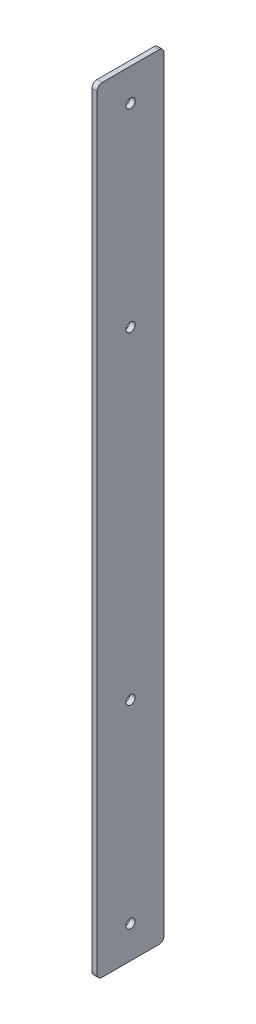
ISO-10303-21;
HEADER;
FILE_DESCRIPTION(('STEP AP214'),'2;1');
FILE_NAME('part.step','',(''),(''),'','','');
FILE_SCHEMA(('AUTOMOTIVE_DESIGN { 1 0 10303 214 1 1 1 1 }'));
ENDSEC;
DATA;
#1=APPLICATION_CONTEXT('core data for automotive mechanical design processes');
#2=APPLICATION_PROTOCOL_DEFINITION('international standard','automotive_design',2000,#1);
#3=PRODUCT_CONTEXT('',#1,'mechanical');
#4=PRODUCT('Part','Part','',(#3));
#5=PRODUCT_RELATED_PRODUCT_CATEGORY('part','',(#4));
#6=PRODUCT_DEFINITION_FORMATION('','',#4);
#7=PRODUCT_DEFINITION_CONTEXT('part definition',#1,'design');
#8=PRODUCT_DEFINITION('design','',#6,#7);
#9=PRODUCT_DEFINITION_SHAPE('','',#8);
#10=(LENGTH_UNIT() NAMED_UNIT(*) SI_UNIT(.MILLI.,.METRE.));
#11=(NAMED_UNIT(*) PLANE_ANGLE_UNIT() SI_UNIT($,.RADIAN.));
#12=(NAMED_UNIT(*) SI_UNIT($,.STERADIAN.) SOLID_ANGLE_UNIT());
#13=UNCERTAINTY_MEASURE_WITH_UNIT(LENGTH_MEASURE(1.E-05),#10,'distance_accuracy_value','');
#14=(GEOMETRIC_REPRESENTATION_CONTEXT(3) GLOBAL_UNCERTAINTY_ASSIGNED_CONTEXT((#13)) GLOBAL_UNIT_ASSIGNED_CONTEXT((#10,
#11,#12)) REPRESENTATION_CONTEXT('',''));
#15=CARTESIAN_POINT('',(0.,0.,0.));
#16=DIRECTION('',(0.,0.,1.));
#17=DIRECTION('',(1.,0.,0.));
#18=AXIS2_PLACEMENT_3D('',#15,#16,#17);
#19=CARTESIAN_POINT('',(2.,0.,0.));
#20=DIRECTION('',(-1.,0.,0.));
#21=DIRECTION('',(0.,0.,1.));
#22=AXIS2_PLACEMENT_3D('',#19,#20,#21);
#23=PLANE('',#22);
#24=CARTESIAN_POINT('',(2.,62.5,0.));
#25=DIRECTION('',(1.,0.,0.));
#26=DIRECTION('',(0.,0.,-1.));
#27=AXIS2_PLACEMENT_3D('',#24,#25,#26);
#28=CIRCLE('',#27,1.75);
#29=CARTESIAN_POINT('',(2.,62.5,-1.75000000000001));
#30=VERTEX_POINT('',#29);
#31=EDGE_CURVE('E231',#30,#30,#28,.T.);
#32=ORIENTED_EDGE('',*,*,#31,.F.);
#33=EDGE_LOOP('',(#32));
#34=FACE_BOUND('',#33,.T.);
#35=CARTESIAN_POINT('',(2.,137.5,0.));
#36=DIRECTION('',(1.,0.,0.));
#37=DIRECTION('',(0.,0.,-1.));
#38=AXIS2_PLACEMENT_3D('',#35,#36,#37);
#39=CIRCLE('',#38,1.75);
#40=CARTESIAN_POINT('',(2.,137.5,-1.75));
#41=VERTEX_POINT('',#40);
#42=EDGE_CURVE('E223',#41,#41,#39,.T.);
#43=ORIENTED_EDGE('',*,*,#42,.F.);
#44=EDGE_LOOP('',(#43));
#45=FACE_BOUND('',#44,.T.);
#46=DIRECTION('',(0.,0.,-1.));
#47=VECTOR('',#46,1.);
#48=CARTESIAN_POINT('',(2.,-150.,13.));
#49=LINE('',#48,#47);
#50=CARTESIAN_POINT('',(2.,-150.,11.));
#51=VERTEX_POINT('',#50);
#52=CARTESIAN_POINT('',(2.,-150.,-11.));
#53=VERTEX_POINT('',#52);
#54=EDGE_CURVE('E150',#51,#53,#49,.T.);
#55=ORIENTED_EDGE('',*,*,#54,.T.);
#56=CARTESIAN_POINT('',(2.,-148.,-11.));
#57=DIRECTION('',(-1.,0.,0.));
#58=DIRECTION('',(0.,0.,1.));
#59=AXIS2_PLACEMENT_3D('',#56,#57,#58);
#60=CIRCLE('',#59,2.);
#61=CARTESIAN_POINT('',(2.,-148.,-13.));
#62=VERTEX_POINT('',#61);
#63=EDGE_CURVE('E179',#53,#62,#60,.F.);
#64=ORIENTED_EDGE('',*,*,#63,.T.);
#65=DIRECTION('',(0.,1.,0.));
#66=VECTOR('',#65,1.);
#67=CARTESIAN_POINT('',(2.,-150.,-13.));
#68=LINE('',#67,#66);
#69=CARTESIAN_POINT('',(2.,148.,-13.));
#70=VERTEX_POINT('',#69);
#71=EDGE_CURVE('E127',#62,#70,#68,.T.);
#72=ORIENTED_EDGE('',*,*,#71,.T.);
#73=CARTESIAN_POINT('',(2.,148.,-11.));
#74=DIRECTION('',(-1.,0.,0.));
#75=DIRECTION('',(0.,0.,1.));
#76=AXIS2_PLACEMENT_3D('',#73,#74,#75);
#77=CIRCLE('',#76,2.);
#78=CARTESIAN_POINT('',(2.,150.,-11.));
#79=VERTEX_POINT('',#78);
#80=EDGE_CURVE('E173',#70,#79,#77,.F.);
#81=ORIENTED_EDGE('',*,*,#80,.T.);
#82=DIRECTION('',(0.,0.,1.));
#83=VECTOR('',#82,1.);
#84=CARTESIAN_POINT('',(2.,150.,13.));
#85=LINE('',#84,#83);
#86=CARTESIAN_POINT('',(2.,150.,11.));
#87=VERTEX_POINT('',#86);
#88=EDGE_CURVE('E193',#79,#87,#85,.T.);
#89=ORIENTED_EDGE('',*,*,#88,.T.);
#90=CARTESIAN_POINT('',(2.,148.,11.));
#91=DIRECTION('',(-1.,0.,0.));
#92=DIRECTION('',(0.,0.,1.));
#93=AXIS2_PLACEMENT_3D('',#90,#91,#92);
#94=CIRCLE('',#93,2.);
#95=CARTESIAN_POINT('',(2.,148.,13.));
#96=VERTEX_POINT('',#95);
#97=EDGE_CURVE('E61',#87,#96,#94,.F.);
#98=ORIENTED_EDGE('',*,*,#97,.T.);
#99=DIRECTION('',(0.,-1.,0.));
#100=VECTOR('',#99,1.);
#101=CARTESIAN_POINT('',(2.,-150.,13.));
#102=LINE('',#101,#100);
#103=CARTESIAN_POINT('',(2.,-148.,13.));
#104=VERTEX_POINT('',#103);
#105=EDGE_CURVE('E200',#96,#104,#102,.T.);
#106=ORIENTED_EDGE('',*,*,#105,.T.);
#107=CARTESIAN_POINT('',(2.,-148.,11.));
#108=DIRECTION('',(-1.,0.,0.));
#109=DIRECTION('',(0.,0.,1.));
#110=AXIS2_PLACEMENT_3D('',#107,#108,#109);
#111=CIRCLE('',#110,2.);
#112=EDGE_CURVE('E176',#104,#51,#111,.F.);
#113=ORIENTED_EDGE('',*,*,#112,.T.);
#114=EDGE_LOOP('',(#55,#64,#72,#81,#89,#98,#106,#113));
#115=FACE_BOUND('',#114,.T.);
#116=CARTESIAN_POINT('',(2.,-62.5,0.));
#117=DIRECTION('',(1.,0.,0.));
#118=DIRECTION('',(0.,0.,-1.));
#119=AXIS2_PLACEMENT_3D('',#116,#117,#118);
#120=CIRCLE('',#119,1.75);
#121=CARTESIAN_POINT('',(2.,-62.5,-1.75000000000001));
#122=VERTEX_POINT('',#121);
#123=EDGE_CURVE('E239',#122,#122,#120,.F.);
#124=ORIENTED_EDGE('',*,*,#123,.T.);
#125=EDGE_LOOP('',(#124));
#126=FACE_BOUND('',#125,.T.);
#127=CARTESIAN_POINT('',(2.,-137.5,0.));
#128=DIRECTION('',(1.,0.,0.));
#129=DIRECTION('',(0.,0.,-1.));
#130=AXIS2_PLACEMENT_3D('',#127,#128,#129);
#131=CIRCLE('',#130,1.75);
#132=CARTESIAN_POINT('',(2.,-137.5,-1.75));
#133=VERTEX_POINT('',#132);
#134=EDGE_CURVE('E147',#133,#133,#131,.F.);
#135=ORIENTED_EDGE('',*,*,#134,.T.);
#136=EDGE_LOOP('',(#135));
#137=FACE_BOUND('',#136,.T.);
#138=ADVANCED_FACE('F38',(#34,#45,#115,#126,#137),#23,.F.);
#139=CARTESIAN_POINT('',(0.,0.,0.));
#140=DIRECTION('',(-1.,0.,0.));
#141=DIRECTION('',(0.,0.,1.));
#142=AXIS2_PLACEMENT_3D('',#139,#140,#141);
#143=PLANE('',#142);
#144=CARTESIAN_POINT('',(0.,-62.5,0.));
#145=DIRECTION('',(1.,0.,0.));
#146=DIRECTION('',(0.,0.,-1.));
#147=AXIS2_PLACEMENT_3D('',#144,#145,#146);
#148=CIRCLE('',#147,1.75);
#149=CARTESIAN_POINT('',(0.,-62.5,-1.75000000000001));
#150=VERTEX_POINT('',#149);
#151=EDGE_CURVE('E235',#150,#150,#148,.F.);
#152=ORIENTED_EDGE('',*,*,#151,.F.);
#153=EDGE_LOOP('',(#152));
#154=FACE_BOUND('',#153,.T.);
#155=CARTESIAN_POINT('',(0.,62.5,0.));
#156=DIRECTION('',(1.,0.,0.));
#157=DIRECTION('',(0.,0.,-1.));
#158=AXIS2_PLACEMENT_3D('',#155,#156,#157);
#159=CIRCLE('',#158,1.75);
#160=CARTESIAN_POINT('',(0.,62.5,-1.75000000000001));
#161=VERTEX_POINT('',#160);
#162=EDGE_CURVE('E227',#161,#161,#159,.T.);
#163=ORIENTED_EDGE('',*,*,#162,.T.);
#164=EDGE_LOOP('',(#163));
#165=FACE_BOUND('',#164,.T.);
#166=CARTESIAN_POINT('',(0.,137.5,0.));
#167=DIRECTION('',(1.,0.,0.));
#168=DIRECTION('',(0.,0.,-1.));
#169=AXIS2_PLACEMENT_3D('',#166,#167,#168);
#170=CIRCLE('',#169,1.75);
#171=CARTESIAN_POINT('',(0.,137.5,-1.75));
#172=VERTEX_POINT('',#171);
#173=EDGE_CURVE('E219',#172,#172,#170,.T.);
#174=ORIENTED_EDGE('',*,*,#173,.T.);
#175=EDGE_LOOP('',(#174));
#176=FACE_BOUND('',#175,.T.);
#177=DIRECTION('',(0.,1.,0.));
#178=VECTOR('',#177,1.);
#179=CARTESIAN_POINT('',(0.,-150.,-13.));
#180=LINE('',#179,#178);
#181=CARTESIAN_POINT('',(0.,-148.,-13.));
#182=VERTEX_POINT('',#181);
#183=CARTESIAN_POINT('',(0.,148.,-13.));
#184=VERTEX_POINT('',#183);
#185=EDGE_CURVE('E124',#182,#184,#180,.T.);
#186=ORIENTED_EDGE('',*,*,#185,.F.);
#187=CARTESIAN_POINT('',(0.,-148.,-11.));
#188=DIRECTION('',(-1.,0.,0.));
#189=DIRECTION('',(0.,0.,1.));
#190=AXIS2_PLACEMENT_3D('',#187,#188,#189);
#191=CIRCLE('',#190,2.);
#192=CARTESIAN_POINT('',(0.,-150.,-11.));
#193=VERTEX_POINT('',#192);
#194=EDGE_CURVE('E106',#182,#193,#191,.T.);
#195=ORIENTED_EDGE('',*,*,#194,.T.);
#196=DIRECTION('',(0.,0.,-1.));
#197=VECTOR('',#196,1.);
#198=CARTESIAN_POINT('',(0.,-150.,13.));
#199=LINE('',#198,#197);
#200=CARTESIAN_POINT('',(0.,-150.,11.));
#201=VERTEX_POINT('',#200);
#202=EDGE_CURVE('E155',#201,#193,#199,.T.);
#203=ORIENTED_EDGE('',*,*,#202,.F.);
#204=CARTESIAN_POINT('',(0.,-148.,11.));
#205=DIRECTION('',(-1.,0.,0.));
#206=DIRECTION('',(0.,0.,1.));
#207=AXIS2_PLACEMENT_3D('',#204,#205,#206);
#208=CIRCLE('',#207,2.);
#209=CARTESIAN_POINT('',(0.,-148.,13.));
#210=VERTEX_POINT('',#209);
#211=EDGE_CURVE('E118',#201,#210,#208,.T.);
#212=ORIENTED_EDGE('',*,*,#211,.T.);
#213=DIRECTION('',(0.,-1.,0.));
#214=VECTOR('',#213,1.);
#215=CARTESIAN_POINT('',(0.,-150.,13.));
#216=LINE('',#215,#214);
#217=CARTESIAN_POINT('',(0.,148.,13.));
#218=VERTEX_POINT('',#217);
#219=EDGE_CURVE('E144',#218,#210,#216,.T.);
#220=ORIENTED_EDGE('',*,*,#219,.F.);
#221=CARTESIAN_POINT('',(0.,148.,11.));
#222=DIRECTION('',(-1.,0.,0.));
#223=DIRECTION('',(0.,0.,1.));
#224=AXIS2_PLACEMENT_3D('',#221,#222,#223);
#225=CIRCLE('',#224,2.);
#226=CARTESIAN_POINT('',(0.,150.,11.));
#227=VERTEX_POINT('',#226);
#228=EDGE_CURVE('E129',#218,#227,#225,.T.);
#229=ORIENTED_EDGE('',*,*,#228,.T.);
#230=DIRECTION('',(0.,0.,1.));
#231=VECTOR('',#230,1.);
#232=CARTESIAN_POINT('',(0.,150.,13.));
#233=LINE('',#232,#231);
#234=CARTESIAN_POINT('',(0.,150.,-11.));
#235=VERTEX_POINT('',#234);
#236=EDGE_CURVE('E137',#235,#227,#233,.T.);
#237=ORIENTED_EDGE('',*,*,#236,.F.);
#238=CARTESIAN_POINT('',(0.,148.,-11.));
#239=DIRECTION('',(-1.,0.,0.));
#240=DIRECTION('',(0.,0.,1.));
#241=AXIS2_PLACEMENT_3D('',#238,#239,#240);
#242=CIRCLE('',#241,2.);
#243=EDGE_CURVE('E135',#235,#184,#242,.T.);
#244=ORIENTED_EDGE('',*,*,#243,.T.);
#245=EDGE_LOOP('',(#186,#195,#203,#212,#220,#229,#237,#244));
#246=FACE_BOUND('',#245,.T.);
#247=CARTESIAN_POINT('',(0.,-137.5,0.));
#248=DIRECTION('',(1.,0.,0.));
#249=DIRECTION('',(0.,0.,-1.));
#250=AXIS2_PLACEMENT_3D('',#247,#248,#249);
#251=CIRCLE('',#250,1.75);
#252=CARTESIAN_POINT('',(0.,-137.5,-1.75));
#253=VERTEX_POINT('',#252);
#254=EDGE_CURVE('E138',#253,#253,#251,.F.);
#255=ORIENTED_EDGE('',*,*,#254,.F.);
#256=EDGE_LOOP('',(#255));
#257=FACE_BOUND('',#256,.T.);
#258=ADVANCED_FACE('F132',(#154,#165,#176,#246,#257),#143,.T.);
#259=CARTESIAN_POINT('',(2.,-150.,-13.));
#260=DIRECTION('',(0.,0.,1.));
#261=DIRECTION('',(1.,0.,0.));
#262=AXIS2_PLACEMENT_3D('',#259,#260,#261);
#263=PLANE('',#262);
#264=ORIENTED_EDGE('',*,*,#71,.F.);
#265=DIRECTION('',(-1.,0.,0.));
#266=VECTOR('',#265,1.);
#267=CARTESIAN_POINT('',(2.,-148.,-13.));
#268=LINE('',#267,#266);
#269=EDGE_CURVE('E110',#62,#182,#268,.T.);
#270=ORIENTED_EDGE('',*,*,#269,.T.);
#271=ORIENTED_EDGE('',*,*,#185,.T.);
#272=DIRECTION('',(-1.,0.,0.));
#273=VECTOR('',#272,1.);
#274=CARTESIAN_POINT('',(2.,148.,-13.));
#275=LINE('',#274,#273);
#276=EDGE_CURVE('E130',#184,#70,#275,.F.);
#277=ORIENTED_EDGE('',*,*,#276,.T.);
#278=EDGE_LOOP('',(#264,#270,#271,#277));
#279=FACE_BOUND('',#278,.T.);
#280=ADVANCED_FACE('F123',(#279),#263,.F.);
#281=CARTESIAN_POINT('',(2.,150.,13.));
#282=DIRECTION('',(0.,-1.,0.));
#283=DIRECTION('',(0.,0.,-1.));
#284=AXIS2_PLACEMENT_3D('',#281,#282,#283);
#285=PLANE('',#284);
#286=ORIENTED_EDGE('',*,*,#88,.F.);
#287=DIRECTION('',(-1.,0.,0.));
#288=VECTOR('',#287,1.);
#289=CARTESIAN_POINT('',(2.,150.,-11.));
#290=LINE('',#289,#288);
#291=EDGE_CURVE('E11',#79,#235,#290,.T.);
#292=ORIENTED_EDGE('',*,*,#291,.T.);
#293=ORIENTED_EDGE('',*,*,#236,.T.);
#294=DIRECTION('',(-1.,0.,0.));
#295=VECTOR('',#294,1.);
#296=CARTESIAN_POINT('',(2.,150.,11.));
#297=LINE('',#296,#295);
#298=EDGE_CURVE('E47',#227,#87,#297,.F.);
#299=ORIENTED_EDGE('',*,*,#298,.T.);
#300=EDGE_LOOP('',(#286,#292,#293,#299));
#301=FACE_BOUND('',#300,.T.);
#302=ADVANCED_FACE('F192',(#301),#285,.F.);
#303=CARTESIAN_POINT('',(2.,-150.,13.));
#304=DIRECTION('',(0.,0.,-1.));
#305=DIRECTION('',(-1.,0.,0.));
#306=AXIS2_PLACEMENT_3D('',#303,#304,#305);
#307=PLANE('',#306);
#308=ORIENTED_EDGE('',*,*,#219,.T.);
#309=DIRECTION('',(-1.,0.,0.));
#310=VECTOR('',#309,1.);
#311=CARTESIAN_POINT('',(2.,-148.,13.));
#312=LINE('',#311,#310);
#313=EDGE_CURVE('E54',#210,#104,#312,.F.);
#314=ORIENTED_EDGE('',*,*,#313,.T.);
#315=ORIENTED_EDGE('',*,*,#105,.F.);
#316=DIRECTION('',(-1.,0.,0.));
#317=VECTOR('',#316,1.);
#318=CARTESIAN_POINT('',(2.,148.,13.));
#319=LINE('',#318,#317);
#320=EDGE_CURVE('E182',#96,#218,#319,.T.);
#321=ORIENTED_EDGE('',*,*,#320,.T.);
#322=EDGE_LOOP('',(#308,#314,#315,#321));
#323=FACE_BOUND('',#322,.T.);
#324=ADVANCED_FACE('F204',(#323),#307,.F.);
#325=CARTESIAN_POINT('',(2.,-150.,13.));
#326=DIRECTION('',(0.,1.,0.));
#327=DIRECTION('',(0.,0.,1.));
#328=AXIS2_PLACEMENT_3D('',#325,#326,#327);
#329=PLANE('',#328);
#330=ORIENTED_EDGE('',*,*,#202,.T.);
#331=DIRECTION('',(-1.,0.,0.));
#332=VECTOR('',#331,1.);
#333=CARTESIAN_POINT('',(2.,-150.,-11.));
#334=LINE('',#333,#332);
#335=EDGE_CURVE('E111',#193,#53,#334,.F.);
#336=ORIENTED_EDGE('',*,*,#335,.T.);
#337=ORIENTED_EDGE('',*,*,#54,.F.);
#338=DIRECTION('',(-1.,0.,0.));
#339=VECTOR('',#338,1.);
#340=CARTESIAN_POINT('',(2.,-150.,11.));
#341=LINE('',#340,#339);
#342=EDGE_CURVE('E117',#51,#201,#341,.T.);
#343=ORIENTED_EDGE('',*,*,#342,.T.);
#344=EDGE_LOOP('',(#330,#336,#337,#343));
#345=FACE_BOUND('',#344,.T.);
#346=ADVANCED_FACE('F211',(#345),#329,.F.);
#347=CARTESIAN_POINT('',(2.,-148.,-11.));
#348=DIRECTION('',(-1.,0.,0.));
#349=DIRECTION('',(0.,0.,1.));
#350=AXIS2_PLACEMENT_3D('',#347,#348,#349);
#351=CYLINDRICAL_SURFACE('',#350,2.);
#352=ORIENTED_EDGE('',*,*,#63,.F.);
#353=ORIENTED_EDGE('',*,*,#335,.F.);
#354=ORIENTED_EDGE('',*,*,#194,.F.);
#355=ORIENTED_EDGE('',*,*,#269,.F.);
#356=EDGE_LOOP('',(#352,#353,#354,#355));
#357=FACE_BOUND('',#356,.T.);
#358=ADVANCED_FACE('F109',(#357),#351,.T.);
#359=CARTESIAN_POINT('',(2.,-148.,11.));
#360=DIRECTION('',(-1.,0.,0.));
#361=DIRECTION('',(0.,0.,1.));
#362=AXIS2_PLACEMENT_3D('',#359,#360,#361);
#363=CYLINDRICAL_SURFACE('',#362,2.);
#364=ORIENTED_EDGE('',*,*,#112,.F.);
#365=ORIENTED_EDGE('',*,*,#313,.F.);
#366=ORIENTED_EDGE('',*,*,#211,.F.);
#367=ORIENTED_EDGE('',*,*,#342,.F.);
#368=EDGE_LOOP('',(#364,#365,#366,#367));
#369=FACE_BOUND('',#368,.T.);
#370=ADVANCED_FACE('F208',(#369),#363,.T.);
#371=CARTESIAN_POINT('',(2.,148.,-11.));
#372=DIRECTION('',(-1.,0.,0.));
#373=DIRECTION('',(0.,0.,1.));
#374=AXIS2_PLACEMENT_3D('',#371,#372,#373);
#375=CYLINDRICAL_SURFACE('',#374,2.);
#376=ORIENTED_EDGE('',*,*,#80,.F.);
#377=ORIENTED_EDGE('',*,*,#276,.F.);
#378=ORIENTED_EDGE('',*,*,#243,.F.);
#379=ORIENTED_EDGE('',*,*,#291,.F.);
#380=EDGE_LOOP('',(#376,#377,#378,#379));
#381=FACE_BOUND('',#380,.T.);
#382=ADVANCED_FACE('F285',(#381),#375,.T.);
#383=CARTESIAN_POINT('',(2.,148.,11.));
#384=DIRECTION('',(-1.,0.,0.));
#385=DIRECTION('',(0.,0.,1.));
#386=AXIS2_PLACEMENT_3D('',#383,#384,#385);
#387=CYLINDRICAL_SURFACE('',#386,2.);
#388=ORIENTED_EDGE('',*,*,#97,.F.);
#389=ORIENTED_EDGE('',*,*,#298,.F.);
#390=ORIENTED_EDGE('',*,*,#228,.F.);
#391=ORIENTED_EDGE('',*,*,#320,.F.);
#392=EDGE_LOOP('',(#388,#389,#390,#391));
#393=FACE_BOUND('',#392,.T.);
#394=ADVANCED_FACE('F40',(#393),#387,.T.);
#395=CARTESIAN_POINT('',(0.,137.5,0.));
#396=DIRECTION('',(1.,0.,0.));
#397=DIRECTION('',(0.,0.,-1.));
#398=AXIS2_PLACEMENT_3D('',#395,#396,#397);
#399=CYLINDRICAL_SURFACE('',#398,1.75);
#400=ORIENTED_EDGE('',*,*,#173,.F.);
#401=EDGE_LOOP('',(#400));
#402=FACE_BOUND('',#401,.T.);
#403=ORIENTED_EDGE('',*,*,#42,.T.);
#404=EDGE_LOOP('',(#403));
#405=FACE_BOUND('',#404,.T.);
#406=ADVANCED_FACE('F271',(#402,#405),#399,.F.);
#407=CARTESIAN_POINT('',(0.,62.5,0.));
#408=DIRECTION('',(1.,0.,0.));
#409=DIRECTION('',(0.,0.,-1.));
#410=AXIS2_PLACEMENT_3D('',#407,#408,#409);
#411=CYLINDRICAL_SURFACE('',#410,1.75);
#412=ORIENTED_EDGE('',*,*,#162,.F.);
#413=EDGE_LOOP('',(#412));
#414=FACE_BOUND('',#413,.T.);
#415=ORIENTED_EDGE('',*,*,#31,.T.);
#416=EDGE_LOOP('',(#415));
#417=FACE_BOUND('',#416,.T.);
#418=ADVANCED_FACE('F257',(#414,#417),#411,.F.);
#419=CARTESIAN_POINT('',(0.,-62.5,0.));
#420=DIRECTION('',(1.,0.,0.));
#421=DIRECTION('',(0.,0.,-1.));
#422=AXIS2_PLACEMENT_3D('',#419,#420,#421);
#423=CYLINDRICAL_SURFACE('',#422,1.75);
#424=ORIENTED_EDGE('',*,*,#151,.T.);
#425=EDGE_LOOP('',(#424));
#426=FACE_BOUND('',#425,.T.);
#427=ORIENTED_EDGE('',*,*,#123,.F.);
#428=EDGE_LOOP('',(#427));
#429=FACE_BOUND('',#428,.T.);
#430=ADVANCED_FACE('F251',(#426,#429),#423,.F.);
#431=CARTESIAN_POINT('',(0.,-137.5,0.));
#432=DIRECTION('',(1.,0.,0.));
#433=DIRECTION('',(0.,0.,-1.));
#434=AXIS2_PLACEMENT_3D('',#431,#432,#433);
#435=CYLINDRICAL_SURFACE('',#434,1.75);
#436=ORIENTED_EDGE('',*,*,#254,.T.);
#437=EDGE_LOOP('',(#436));
#438=FACE_BOUND('',#437,.T.);
#439=ORIENTED_EDGE('',*,*,#134,.F.);
#440=EDGE_LOOP('',(#439));
#441=FACE_BOUND('',#440,.T.);
#442=ADVANCED_FACE('F249',(#438,#441),#435,.F.);
#443=CLOSED_SHELL('',(#138,#258,#280,#302,#324,#346,#358,#370,#382,#394,#406,#418,#430,#442));
#444=MANIFOLD_SOLID_BREP('B2',#443);
#445=ADVANCED_BREP_SHAPE_REPRESENTATION('',(#18,#444),#14);
#446=SHAPE_DEFINITION_REPRESENTATION(#9,#445);
ENDSEC;
END-ISO-10303-21;
